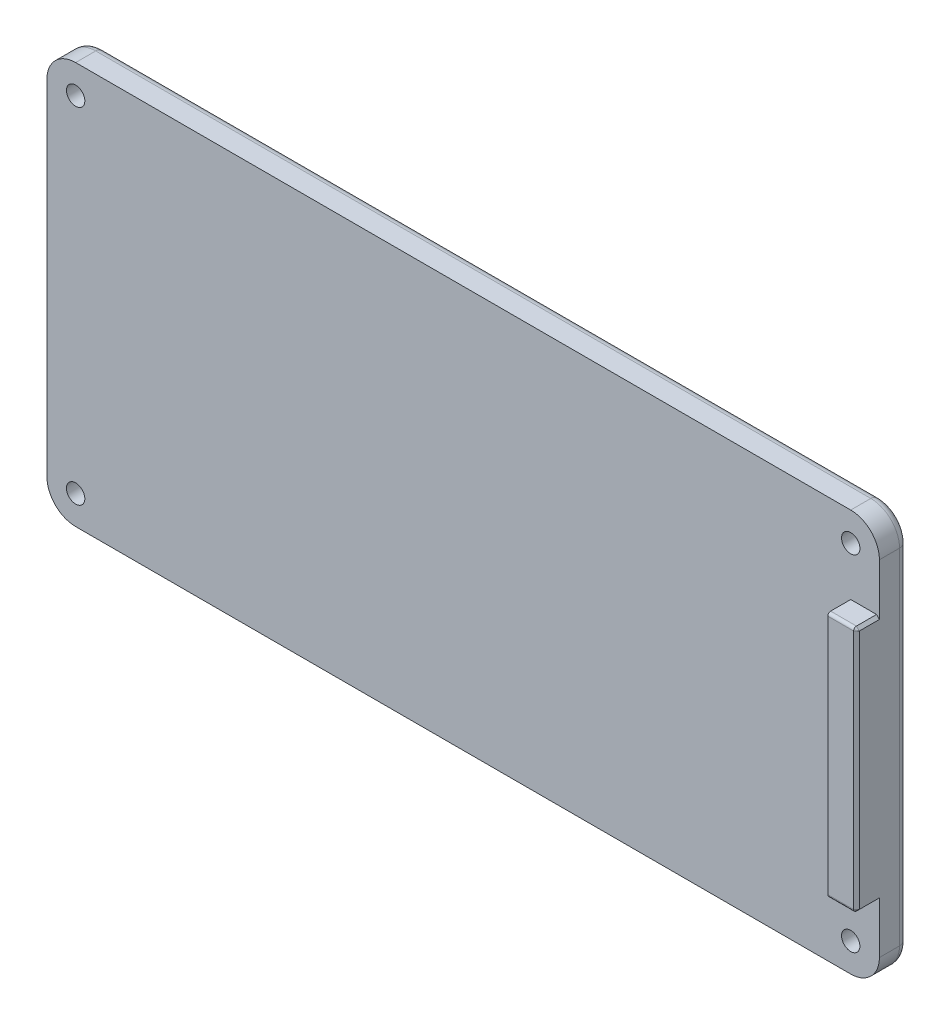
ISO-10303-21;
HEADER;
FILE_DESCRIPTION(('STEP AP214'),'2;1');
FILE_NAME('part.step','',(''),(''),'','','');
FILE_SCHEMA(('AUTOMOTIVE_DESIGN { 1 0 10303 214 1 1 1 1 }'));
ENDSEC;
DATA;
#1=APPLICATION_CONTEXT('core data for automotive mechanical design processes');
#2=APPLICATION_PROTOCOL_DEFINITION('international standard','automotive_design',2000,#1);
#3=PRODUCT_CONTEXT('',#1,'mechanical');
#4=PRODUCT('Part','Part','',(#3));
#5=PRODUCT_RELATED_PRODUCT_CATEGORY('part','',(#4));
#6=PRODUCT_DEFINITION_FORMATION('','',#4);
#7=PRODUCT_DEFINITION_CONTEXT('part definition',#1,'design');
#8=PRODUCT_DEFINITION('design','',#6,#7);
#9=PRODUCT_DEFINITION_SHAPE('','',#8);
#10=(LENGTH_UNIT() NAMED_UNIT(*) SI_UNIT(.MILLI.,.METRE.));
#11=(NAMED_UNIT(*) PLANE_ANGLE_UNIT() SI_UNIT($,.RADIAN.));
#12=(NAMED_UNIT(*) SI_UNIT($,.STERADIAN.) SOLID_ANGLE_UNIT());
#13=UNCERTAINTY_MEASURE_WITH_UNIT(LENGTH_MEASURE(1.E-05),#10,'distance_accuracy_value','');
#14=(GEOMETRIC_REPRESENTATION_CONTEXT(3) GLOBAL_UNCERTAINTY_ASSIGNED_CONTEXT((#13)) GLOBAL_UNIT_ASSIGNED_CONTEXT((#10,
#11,#12)) REPRESENTATION_CONTEXT('',''));
#15=CARTESIAN_POINT('',(0.,0.,0.));
#16=DIRECTION('',(0.,0.,1.));
#17=DIRECTION('',(1.,0.,0.));
#18=AXIS2_PLACEMENT_3D('',#15,#16,#17);
#19=CARTESIAN_POINT('',(0.,0.,5.));
#20=DIRECTION('',(0.,0.,-1.));
#21=DIRECTION('',(-1.,0.,0.));
#22=AXIS2_PLACEMENT_3D('',#19,#20,#21);
#23=PLANE('',#22);
#24=CARTESIAN_POINT('',(-67.5,-30.,5.));
#25=DIRECTION('',(0.,0.,-1.));
#26=DIRECTION('',(-1.,0.,0.));
#27=AXIS2_PLACEMENT_3D('',#24,#25,#26);
#28=CIRCLE('',#27,1.6);
#29=CARTESIAN_POINT('',(-69.1,-30.,5.));
#30=VERTEX_POINT('',#29);
#31=EDGE_CURVE('E255',#30,#30,#28,.T.);
#32=ORIENTED_EDGE('',*,*,#31,.T.);
#33=EDGE_LOOP('',(#32));
#34=FACE_BOUND('',#33,.T.);
#35=CARTESIAN_POINT('',(-67.5,30.,5.));
#36=DIRECTION('',(0.,0.,-1.));
#37=DIRECTION('',(-1.,0.,0.));
#38=AXIS2_PLACEMENT_3D('',#35,#36,#37);
#39=CIRCLE('',#38,1.6);
#40=CARTESIAN_POINT('',(-69.1,30.,5.));
#41=VERTEX_POINT('',#40);
#42=EDGE_CURVE('E243',#41,#41,#39,.T.);
#43=ORIENTED_EDGE('',*,*,#42,.T.);
#44=EDGE_LOOP('',(#43));
#45=FACE_BOUND('',#44,.T.);
#46=CARTESIAN_POINT('',(67.5,-30.,5.));
#47=DIRECTION('',(0.,0.,-1.));
#48=DIRECTION('',(-1.,0.,0.));
#49=AXIS2_PLACEMENT_3D('',#46,#47,#48);
#50=CIRCLE('',#49,1.6);
#51=CARTESIAN_POINT('',(65.9,-30.,5.));
#52=VERTEX_POINT('',#51);
#53=EDGE_CURVE('E231',#52,#52,#50,.T.);
#54=ORIENTED_EDGE('',*,*,#53,.T.);
#55=EDGE_LOOP('',(#54));
#56=FACE_BOUND('',#55,.T.);
#57=CARTESIAN_POINT('',(67.5,30.,5.));
#58=DIRECTION('',(0.,0.,-1.));
#59=DIRECTION('',(-1.,0.,0.));
#60=AXIS2_PLACEMENT_3D('',#57,#58,#59);
#61=CIRCLE('',#60,1.6);
#62=CARTESIAN_POINT('',(65.9,30.,5.));
#63=VERTEX_POINT('',#62);
#64=EDGE_CURVE('E219',#63,#63,#61,.T.);
#65=ORIENTED_EDGE('',*,*,#64,.T.);
#66=EDGE_LOOP('',(#65));
#67=FACE_BOUND('',#66,.T.);
#68=DIRECTION('',(1.,0.,0.));
#69=VECTOR('',#68,1.);
#70=CARTESIAN_POINT('',(72.5,-21.5,5.));
#71=LINE('',#70,#69);
#72=CARTESIAN_POINT('',(67.5,-21.5,5.));
#73=VERTEX_POINT('',#72);
#74=CARTESIAN_POINT('',(72.,-21.5,5.));
#75=VERTEX_POINT('',#74);
#76=EDGE_CURVE('E204',#73,#75,#71,.T.);
#77=ORIENTED_EDGE('',*,*,#76,.F.);
#78=DIRECTION('',(0.,-1.,0.));
#79=VECTOR('',#78,1.);
#80=CARTESIAN_POINT('',(67.5,21.5,5.));
#81=LINE('',#80,#79);
#82=CARTESIAN_POINT('',(67.5,21.5,5.));
#83=VERTEX_POINT('',#82);
#84=EDGE_CURVE('E189',#83,#73,#81,.T.);
#85=ORIENTED_EDGE('',*,*,#84,.F.);
#86=DIRECTION('',(-1.,0.,0.));
#87=VECTOR('',#86,1.);
#88=CARTESIAN_POINT('',(72.5,21.5,5.));
#89=LINE('',#88,#87);
#90=CARTESIAN_POINT('',(72.,21.5,5.));
#91=VERTEX_POINT('',#90);
#92=EDGE_CURVE('E177',#91,#83,#89,.T.);
#93=ORIENTED_EDGE('',*,*,#92,.F.);
#94=DIRECTION('',(-0.707106781186557,0.707106781186538,0.));
#95=VECTOR('',#94,1.);
#96=CARTESIAN_POINT('',(46.749999999999,46.7500000000003,5.));
#97=LINE('',#96,#95);
#98=CARTESIAN_POINT('',(72.5,21.,5.));
#99=VERTEX_POINT('',#98);
#100=EDGE_CURVE('E326',#91,#99,#97,.F.);
#101=ORIENTED_EDGE('',*,*,#100,.T.);
#102=DIRECTION('',(0.,1.,0.));
#103=VECTOR('',#102,1.);
#104=CARTESIAN_POINT('',(72.5,-35.,5.));
#105=LINE('',#104,#103);
#106=CARTESIAN_POINT('',(72.5,30.,5.));
#107=VERTEX_POINT('',#106);
#108=EDGE_CURVE('E258',#99,#107,#105,.T.);
#109=ORIENTED_EDGE('',*,*,#108,.T.);
#110=CARTESIAN_POINT('',(67.5,30.,5.));
#111=DIRECTION('',(0.,0.,-1.));
#112=DIRECTION('',(-1.,0.,0.));
#113=AXIS2_PLACEMENT_3D('',#110,#111,#112);
#114=CIRCLE('',#113,5.);
#115=CARTESIAN_POINT('',(67.5,35.,5.));
#116=VERTEX_POINT('',#115);
#117=EDGE_CURVE('E281',#107,#116,#114,.F.);
#118=ORIENTED_EDGE('',*,*,#117,.T.);
#119=DIRECTION('',(-1.,0.,0.));
#120=VECTOR('',#119,1.);
#121=CARTESIAN_POINT('',(-72.5,35.,5.));
#122=LINE('',#121,#120);
#123=CARTESIAN_POINT('',(-67.5,35.,5.));
#124=VERTEX_POINT('',#123);
#125=EDGE_CURVE('E261',#116,#124,#122,.T.);
#126=ORIENTED_EDGE('',*,*,#125,.T.);
#127=CARTESIAN_POINT('',(-67.5,30.,5.));
#128=DIRECTION('',(0.,0.,-1.));
#129=DIRECTION('',(-1.,0.,0.));
#130=AXIS2_PLACEMENT_3D('',#127,#128,#129);
#131=CIRCLE('',#130,5.);
#132=CARTESIAN_POINT('',(-72.5,30.,5.));
#133=VERTEX_POINT('',#132);
#134=EDGE_CURVE('E279',#124,#133,#131,.F.);
#135=ORIENTED_EDGE('',*,*,#134,.T.);
#136=DIRECTION('',(0.,-1.,0.));
#137=VECTOR('',#136,1.);
#138=CARTESIAN_POINT('',(-72.5,-35.,5.));
#139=LINE('',#138,#137);
#140=CARTESIAN_POINT('',(-72.5,-30.,5.));
#141=VERTEX_POINT('',#140);
#142=EDGE_CURVE('E264',#133,#141,#139,.T.);
#143=ORIENTED_EDGE('',*,*,#142,.T.);
#144=CARTESIAN_POINT('',(-67.5,-30.,5.));
#145=DIRECTION('',(0.,0.,-1.));
#146=DIRECTION('',(-1.,0.,0.));
#147=AXIS2_PLACEMENT_3D('',#144,#145,#146);
#148=CIRCLE('',#147,5.);
#149=CARTESIAN_POINT('',(-67.5,-35.,5.));
#150=VERTEX_POINT('',#149);
#151=EDGE_CURVE('E283',#141,#150,#148,.F.);
#152=ORIENTED_EDGE('',*,*,#151,.T.);
#153=DIRECTION('',(1.,0.,0.));
#154=VECTOR('',#153,1.);
#155=CARTESIAN_POINT('',(-72.5,-35.,5.));
#156=LINE('',#155,#154);
#157=CARTESIAN_POINT('',(67.5,-35.,5.));
#158=VERTEX_POINT('',#157);
#159=EDGE_CURVE('E267',#150,#158,#156,.T.);
#160=ORIENTED_EDGE('',*,*,#159,.T.);
#161=CARTESIAN_POINT('',(67.5,-30.,5.));
#162=DIRECTION('',(0.,0.,-1.));
#163=DIRECTION('',(-1.,0.,0.));
#164=AXIS2_PLACEMENT_3D('',#161,#162,#163);
#165=CIRCLE('',#164,5.);
#166=CARTESIAN_POINT('',(72.5,-30.,5.));
#167=VERTEX_POINT('',#166);
#168=EDGE_CURVE('E285',#158,#167,#165,.F.);
#169=ORIENTED_EDGE('',*,*,#168,.T.);
#170=CARTESIAN_POINT('',(72.5,-21.,5.));
#171=VERTEX_POINT('',#170);
#172=EDGE_CURVE('E259',#167,#171,#105,.T.);
#173=ORIENTED_EDGE('',*,*,#172,.T.);
#174=DIRECTION('',(0.707106781186538,0.707106781186557,0.));
#175=VECTOR('',#174,1.);
#176=CARTESIAN_POINT('',(46.750000000001,-46.7499999999997,5.));
#177=LINE('',#176,#175);
#178=EDGE_CURVE('E324',#171,#75,#177,.F.);
#179=ORIENTED_EDGE('',*,*,#178,.T.);
#180=EDGE_LOOP('',(#77,#85,#93,#101,#109,#118,#126,#135,#143,#152,#160,#169,#173,#179));
#181=FACE_BOUND('',#180,.T.);
#182=ADVANCED_FACE('F39',(#34,#45,#56,#67,#181),#23,.F.);
#183=CARTESIAN_POINT('',(72.5,-35.,5.));
#184=DIRECTION('',(-1.,0.,0.));
#185=DIRECTION('',(0.,0.,1.));
#186=AXIS2_PLACEMENT_3D('',#183,#184,#185);
#187=PLANE('',#186);
#188=DIRECTION('',(0.,0.,-1.));
#189=VECTOR('',#188,1.);
#190=CARTESIAN_POINT('',(72.5,-30.,5.));
#191=LINE('',#190,#189);
#192=CARTESIAN_POINT('',(72.5,-30.,1.5));
#193=VERTEX_POINT('',#192);
#194=EDGE_CURVE('E272',#167,#193,#191,.T.);
#195=ORIENTED_EDGE('',*,*,#194,.T.);
#196=DIRECTION('',(0.,1.,0.));
#197=VECTOR('',#196,1.);
#198=CARTESIAN_POINT('',(72.5,30.,1.5));
#199=LINE('',#198,#197);
#200=CARTESIAN_POINT('',(72.5,30.,1.5));
#201=VERTEX_POINT('',#200);
#202=EDGE_CURVE('E11',#193,#201,#199,.T.);
#203=ORIENTED_EDGE('',*,*,#202,.T.);
#204=DIRECTION('',(0.,0.,-1.));
#205=VECTOR('',#204,1.);
#206=CARTESIAN_POINT('',(72.5,30.,5.));
#207=LINE('',#206,#205);
#208=EDGE_CURVE('E270',#201,#107,#207,.F.);
#209=ORIENTED_EDGE('',*,*,#208,.T.);
#210=ORIENTED_EDGE('',*,*,#108,.F.);
#211=DIRECTION('',(0.,0.,1.));
#212=VECTOR('',#211,1.);
#213=CARTESIAN_POINT('',(72.5,21.,5.));
#214=LINE('',#213,#212);
#215=CARTESIAN_POINT('',(72.5,21.,8.49999999999999));
#216=VERTEX_POINT('',#215);
#217=EDGE_CURVE('E310',#99,#216,#214,.T.);
#218=ORIENTED_EDGE('',*,*,#217,.T.);
#219=DIRECTION('',(0.,-1.,0.));
#220=VECTOR('',#219,1.);
#221=CARTESIAN_POINT('',(72.5,-35.,8.49999999999999));
#222=LINE('',#221,#220);
#223=CARTESIAN_POINT('',(72.5,-21.,8.49999999999999));
#224=VERTEX_POINT('',#223);
#225=EDGE_CURVE('E308',#216,#224,#222,.T.);
#226=ORIENTED_EDGE('',*,*,#225,.T.);
#227=DIRECTION('',(0.,0.,-1.));
#228=VECTOR('',#227,1.);
#229=CARTESIAN_POINT('',(72.5,-21.,5.));
#230=LINE('',#229,#228);
#231=EDGE_CURVE('E312',#224,#171,#230,.T.);
#232=ORIENTED_EDGE('',*,*,#231,.T.);
#233=ORIENTED_EDGE('',*,*,#172,.F.);
#234=EDGE_LOOP('',(#195,#203,#209,#210,#218,#226,#232,#233));
#235=FACE_BOUND('',#234,.T.);
#236=ADVANCED_FACE('F439',(#235),#187,.F.);
#237=CARTESIAN_POINT('',(-72.5,35.,5.));
#238=DIRECTION('',(0.,-1.,0.));
#239=DIRECTION('',(1.,0.,0.));
#240=AXIS2_PLACEMENT_3D('',#237,#238,#239);
#241=PLANE('',#240);
#242=DIRECTION('',(0.,0.,-1.));
#243=VECTOR('',#242,1.);
#244=CARTESIAN_POINT('',(67.5,35.,5.));
#245=LINE('',#244,#243);
#246=CARTESIAN_POINT('',(67.5,35.,1.5));
#247=VERTEX_POINT('',#246);
#248=EDGE_CURVE('E294',#116,#247,#245,.T.);
#249=ORIENTED_EDGE('',*,*,#248,.T.);
#250=DIRECTION('',(-1.,0.,0.));
#251=VECTOR('',#250,1.);
#252=CARTESIAN_POINT('',(-67.5,35.,1.5));
#253=LINE('',#252,#251);
#254=CARTESIAN_POINT('',(-67.5,35.,1.5));
#255=VERTEX_POINT('',#254);
#256=EDGE_CURVE('E367',#247,#255,#253,.T.);
#257=ORIENTED_EDGE('',*,*,#256,.T.);
#258=DIRECTION('',(0.,0.,-1.));
#259=VECTOR('',#258,1.);
#260=CARTESIAN_POINT('',(-67.5,35.,5.));
#261=LINE('',#260,#259);
#262=EDGE_CURVE('E292',#255,#124,#261,.F.);
#263=ORIENTED_EDGE('',*,*,#262,.T.);
#264=ORIENTED_EDGE('',*,*,#125,.F.);
#265=EDGE_LOOP('',(#249,#257,#263,#264));
#266=FACE_BOUND('',#265,.T.);
#267=ADVANCED_FACE('F480',(#266),#241,.F.);
#268=CARTESIAN_POINT('',(-72.5,-35.,5.));
#269=DIRECTION('',(1.,0.,0.));
#270=DIRECTION('',(0.,0.,-1.));
#271=AXIS2_PLACEMENT_3D('',#268,#269,#270);
#272=PLANE('',#271);
#273=DIRECTION('',(0.,0.,-1.));
#274=VECTOR('',#273,1.);
#275=CARTESIAN_POINT('',(-72.5,30.,5.));
#276=LINE('',#275,#274);
#277=CARTESIAN_POINT('',(-72.5,30.,1.5));
#278=VERTEX_POINT('',#277);
#279=EDGE_CURVE('E287',#133,#278,#276,.T.);
#280=ORIENTED_EDGE('',*,*,#279,.T.);
#281=DIRECTION('',(0.,-1.,0.));
#282=VECTOR('',#281,1.);
#283=CARTESIAN_POINT('',(-72.5,-30.,1.5));
#284=LINE('',#283,#282);
#285=CARTESIAN_POINT('',(-72.5,-30.,1.5));
#286=VERTEX_POINT('',#285);
#287=EDGE_CURVE('E363',#278,#286,#284,.T.);
#288=ORIENTED_EDGE('',*,*,#287,.T.);
#289=DIRECTION('',(0.,0.,-1.));
#290=VECTOR('',#289,1.);
#291=CARTESIAN_POINT('',(-72.5,-30.,5.));
#292=LINE('',#291,#290);
#293=EDGE_CURVE('E290',#286,#141,#292,.F.);
#294=ORIENTED_EDGE('',*,*,#293,.T.);
#295=ORIENTED_EDGE('',*,*,#142,.F.);
#296=EDGE_LOOP('',(#280,#288,#294,#295));
#297=FACE_BOUND('',#296,.T.);
#298=ADVANCED_FACE('F408',(#297),#272,.F.);
#299=CARTESIAN_POINT('',(-72.5,-35.,5.));
#300=DIRECTION('',(0.,1.,0.));
#301=DIRECTION('',(-1.,0.,0.));
#302=AXIS2_PLACEMENT_3D('',#299,#300,#301);
#303=PLANE('',#302);
#304=DIRECTION('',(0.,0.,-1.));
#305=VECTOR('',#304,1.);
#306=CARTESIAN_POINT('',(-67.5,-35.,5.));
#307=LINE('',#306,#305);
#308=CARTESIAN_POINT('',(-67.5,-35.,1.5));
#309=VERTEX_POINT('',#308);
#310=EDGE_CURVE('E274',#150,#309,#307,.T.);
#311=ORIENTED_EDGE('',*,*,#310,.T.);
#312=DIRECTION('',(1.,0.,0.));
#313=VECTOR('',#312,1.);
#314=CARTESIAN_POINT('',(67.5,-35.,1.5));
#315=LINE('',#314,#313);
#316=CARTESIAN_POINT('',(67.5,-35.,1.5));
#317=VERTEX_POINT('',#316);
#318=EDGE_CURVE('E359',#309,#317,#315,.T.);
#319=ORIENTED_EDGE('',*,*,#318,.T.);
#320=DIRECTION('',(0.,0.,-1.));
#321=VECTOR('',#320,1.);
#322=CARTESIAN_POINT('',(67.5,-35.,5.));
#323=LINE('',#322,#321);
#324=EDGE_CURVE('E277',#317,#158,#323,.F.);
#325=ORIENTED_EDGE('',*,*,#324,.T.);
#326=ORIENTED_EDGE('',*,*,#159,.F.);
#327=EDGE_LOOP('',(#311,#319,#325,#326));
#328=FACE_BOUND('',#327,.T.);
#329=ADVANCED_FACE('F419',(#328),#303,.F.);
#330=CARTESIAN_POINT('',(0.,0.,0.));
#331=DIRECTION('',(0.,0.,-1.));
#332=DIRECTION('',(-1.,0.,0.));
#333=AXIS2_PLACEMENT_3D('',#330,#331,#332);
#334=PLANE('',#333);
#335=DIRECTION('',(0.,1.,0.));
#336=VECTOR('',#335,1.);
#337=CARTESIAN_POINT('',(71.,-30.,0.));
#338=LINE('',#337,#336);
#339=CARTESIAN_POINT('',(71.,30.,0.));
#340=VERTEX_POINT('',#339);
#341=CARTESIAN_POINT('',(71.,-30.,0.));
#342=VERTEX_POINT('',#341);
#343=EDGE_CURVE('E328',#340,#342,#338,.F.);
#344=ORIENTED_EDGE('',*,*,#343,.T.);
#345=CARTESIAN_POINT('',(67.5,-30.,0.));
#346=DIRECTION('',(0.,0.,-1.));
#347=DIRECTION('',(-1.,0.,0.));
#348=AXIS2_PLACEMENT_3D('',#345,#346,#347);
#349=CIRCLE('',#348,3.5);
#350=CARTESIAN_POINT('',(67.5,-33.5,0.));
#351=VERTEX_POINT('',#350);
#352=EDGE_CURVE('E353',#342,#351,#349,.T.);
#353=ORIENTED_EDGE('',*,*,#352,.T.);
#354=DIRECTION('',(1.,0.,0.));
#355=VECTOR('',#354,1.);
#356=CARTESIAN_POINT('',(-67.5,-33.5,0.));
#357=LINE('',#356,#355);
#358=CARTESIAN_POINT('',(-67.5,-33.5,0.));
#359=VERTEX_POINT('',#358);
#360=EDGE_CURVE('E351',#351,#359,#357,.F.);
#361=ORIENTED_EDGE('',*,*,#360,.T.);
#362=CARTESIAN_POINT('',(-67.5,-30.,0.));
#363=DIRECTION('',(0.,0.,-1.));
#364=DIRECTION('',(-1.,0.,0.));
#365=AXIS2_PLACEMENT_3D('',#362,#363,#364);
#366=CIRCLE('',#365,3.5);
#367=CARTESIAN_POINT('',(-71.,-30.,0.));
#368=VERTEX_POINT('',#367);
#369=EDGE_CURVE('E349',#359,#368,#366,.T.);
#370=ORIENTED_EDGE('',*,*,#369,.T.);
#371=DIRECTION('',(0.,-1.,0.));
#372=VECTOR('',#371,1.);
#373=CARTESIAN_POINT('',(-71.,30.,0.));
#374=LINE('',#373,#372);
#375=CARTESIAN_POINT('',(-71.,30.,0.));
#376=VERTEX_POINT('',#375);
#377=EDGE_CURVE('E347',#368,#376,#374,.F.);
#378=ORIENTED_EDGE('',*,*,#377,.T.);
#379=CARTESIAN_POINT('',(-67.5,30.,0.));
#380=DIRECTION('',(0.,0.,-1.));
#381=DIRECTION('',(-1.,0.,0.));
#382=AXIS2_PLACEMENT_3D('',#379,#380,#381);
#383=CIRCLE('',#382,3.5);
#384=CARTESIAN_POINT('',(-67.5,33.5,0.));
#385=VERTEX_POINT('',#384);
#386=EDGE_CURVE('E345',#376,#385,#383,.T.);
#387=ORIENTED_EDGE('',*,*,#386,.T.);
#388=DIRECTION('',(-1.,0.,0.));
#389=VECTOR('',#388,1.);
#390=CARTESIAN_POINT('',(67.5,33.5,0.));
#391=LINE('',#390,#389);
#392=CARTESIAN_POINT('',(67.5,33.5,0.));
#393=VERTEX_POINT('',#392);
#394=EDGE_CURVE('E343',#385,#393,#391,.F.);
#395=ORIENTED_EDGE('',*,*,#394,.T.);
#396=CARTESIAN_POINT('',(67.5,30.,0.));
#397=DIRECTION('',(0.,0.,-1.));
#398=DIRECTION('',(-1.,0.,0.));
#399=AXIS2_PLACEMENT_3D('',#396,#397,#398);
#400=CIRCLE('',#399,3.5);
#401=EDGE_CURVE('E341',#393,#340,#400,.T.);
#402=ORIENTED_EDGE('',*,*,#401,.T.);
#403=EDGE_LOOP('',(#344,#353,#361,#370,#378,#387,#395,#402));
#404=FACE_BOUND('',#403,.T.);
#405=CARTESIAN_POINT('',(67.5,30.,0.));
#406=DIRECTION('',(0.,0.,-1.));
#407=DIRECTION('',(-1.,0.,0.));
#408=AXIS2_PLACEMENT_3D('',#405,#406,#407);
#409=CIRCLE('',#408,3.15);
#410=CARTESIAN_POINT('',(64.35,30.,0.));
#411=VERTEX_POINT('',#410);
#412=EDGE_CURVE('E199',#411,#411,#409,.T.);
#413=ORIENTED_EDGE('',*,*,#412,.F.);
#414=EDGE_LOOP('',(#413));
#415=FACE_BOUND('',#414,.T.);
#416=CARTESIAN_POINT('',(67.5,-30.,0.));
#417=DIRECTION('',(0.,0.,-1.));
#418=DIRECTION('',(-1.,0.,0.));
#419=AXIS2_PLACEMENT_3D('',#416,#417,#418);
#420=CIRCLE('',#419,3.15);
#421=CARTESIAN_POINT('',(64.35,-30.,0.));
#422=VERTEX_POINT('',#421);
#423=EDGE_CURVE('E222',#422,#422,#420,.T.);
#424=ORIENTED_EDGE('',*,*,#423,.F.);
#425=EDGE_LOOP('',(#424));
#426=FACE_BOUND('',#425,.T.);
#427=CARTESIAN_POINT('',(-67.5,30.,0.));
#428=DIRECTION('',(0.,0.,-1.));
#429=DIRECTION('',(-1.,0.,0.));
#430=AXIS2_PLACEMENT_3D('',#427,#428,#429);
#431=CIRCLE('',#430,3.15);
#432=CARTESIAN_POINT('',(-70.65,30.,0.));
#433=VERTEX_POINT('',#432);
#434=EDGE_CURVE('E234',#433,#433,#431,.T.);
#435=ORIENTED_EDGE('',*,*,#434,.F.);
#436=EDGE_LOOP('',(#435));
#437=FACE_BOUND('',#436,.T.);
#438=CARTESIAN_POINT('',(-67.5,-30.,0.));
#439=DIRECTION('',(0.,0.,-1.));
#440=DIRECTION('',(-1.,0.,0.));
#441=AXIS2_PLACEMENT_3D('',#438,#439,#440);
#442=CIRCLE('',#441,3.15);
#443=CARTESIAN_POINT('',(-70.65,-30.,0.));
#444=VERTEX_POINT('',#443);
#445=EDGE_CURVE('E246',#444,#444,#442,.T.);
#446=ORIENTED_EDGE('',*,*,#445,.F.);
#447=EDGE_LOOP('',(#446));
#448=FACE_BOUND('',#447,.T.);
#449=ADVANCED_FACE('F499',(#404,#415,#426,#437,#448),#334,.T.);
#450=CARTESIAN_POINT('',(67.5,-30.,5.));
#451=DIRECTION('',(0.,0.,-1.));
#452=DIRECTION('',(-1.,0.,0.));
#453=AXIS2_PLACEMENT_3D('',#450,#451,#452);
#454=CYLINDRICAL_SURFACE('',#453,5.);
#455=ORIENTED_EDGE('',*,*,#324,.F.);
#456=CARTESIAN_POINT('',(67.5,-30.,1.5));
#457=DIRECTION('',(0.,0.,-1.));
#458=DIRECTION('',(-1.,0.,0.));
#459=AXIS2_PLACEMENT_3D('',#456,#457,#458);
#460=CIRCLE('',#459,5.);
#461=EDGE_CURVE('E356',#317,#193,#460,.F.);
#462=ORIENTED_EDGE('',*,*,#461,.T.);
#463=ORIENTED_EDGE('',*,*,#194,.F.);
#464=ORIENTED_EDGE('',*,*,#168,.F.);
#465=EDGE_LOOP('',(#455,#462,#463,#464));
#466=FACE_BOUND('',#465,.T.);
#467=ADVANCED_FACE('F436',(#466),#454,.T.);
#468=CARTESIAN_POINT('',(-67.5,-30.,5.));
#469=DIRECTION('',(0.,0.,-1.));
#470=DIRECTION('',(-1.,0.,0.));
#471=AXIS2_PLACEMENT_3D('',#468,#469,#470);
#472=CYLINDRICAL_SURFACE('',#471,5.);
#473=ORIENTED_EDGE('',*,*,#293,.F.);
#474=CARTESIAN_POINT('',(-67.5,-30.,1.5));
#475=DIRECTION('',(0.,0.,-1.));
#476=DIRECTION('',(-1.,0.,0.));
#477=AXIS2_PLACEMENT_3D('',#474,#475,#476);
#478=CIRCLE('',#477,5.);
#479=EDGE_CURVE('E361',#286,#309,#478,.F.);
#480=ORIENTED_EDGE('',*,*,#479,.T.);
#481=ORIENTED_EDGE('',*,*,#310,.F.);
#482=ORIENTED_EDGE('',*,*,#151,.F.);
#483=EDGE_LOOP('',(#473,#480,#481,#482));
#484=FACE_BOUND('',#483,.T.);
#485=ADVANCED_FACE('F414',(#484),#472,.T.);
#486=CARTESIAN_POINT('',(67.5,30.,5.));
#487=DIRECTION('',(0.,0.,-1.));
#488=DIRECTION('',(-1.,0.,0.));
#489=AXIS2_PLACEMENT_3D('',#486,#487,#488);
#490=CYLINDRICAL_SURFACE('',#489,5.);
#491=ORIENTED_EDGE('',*,*,#208,.F.);
#492=CARTESIAN_POINT('',(67.5,30.,1.5));
#493=DIRECTION('',(0.,0.,-1.));
#494=DIRECTION('',(-1.,0.,0.));
#495=AXIS2_PLACEMENT_3D('',#492,#493,#494);
#496=CIRCLE('',#495,5.);
#497=EDGE_CURVE('E48',#201,#247,#496,.F.);
#498=ORIENTED_EDGE('',*,*,#497,.T.);
#499=ORIENTED_EDGE('',*,*,#248,.F.);
#500=ORIENTED_EDGE('',*,*,#117,.F.);
#501=EDGE_LOOP('',(#491,#498,#499,#500));
#502=FACE_BOUND('',#501,.T.);
#503=ADVANCED_FACE('F478',(#502),#490,.T.);
#504=CARTESIAN_POINT('',(-67.5,30.,5.));
#505=DIRECTION('',(0.,0.,-1.));
#506=DIRECTION('',(-1.,0.,0.));
#507=AXIS2_PLACEMENT_3D('',#504,#505,#506);
#508=CYLINDRICAL_SURFACE('',#507,5.);
#509=ORIENTED_EDGE('',*,*,#262,.F.);
#510=CARTESIAN_POINT('',(-67.5,30.,1.5));
#511=DIRECTION('',(0.,0.,-1.));
#512=DIRECTION('',(-1.,0.,0.));
#513=AXIS2_PLACEMENT_3D('',#510,#511,#512);
#514=CIRCLE('',#513,5.);
#515=EDGE_CURVE('E365',#255,#278,#514,.F.);
#516=ORIENTED_EDGE('',*,*,#515,.T.);
#517=ORIENTED_EDGE('',*,*,#279,.F.);
#518=ORIENTED_EDGE('',*,*,#134,.F.);
#519=EDGE_LOOP('',(#509,#516,#517,#518));
#520=FACE_BOUND('',#519,.T.);
#521=ADVANCED_FACE('F404',(#520),#508,.T.);
#522=CARTESIAN_POINT('',(-67.5,-30.,0.));
#523=DIRECTION('',(0.,0.,-1.));
#524=DIRECTION('',(-1.,0.,0.));
#525=AXIS2_PLACEMENT_3D('',#522,#523,#524);
#526=CYLINDRICAL_SURFACE('',#525,1.6);
#527=ORIENTED_EDGE('',*,*,#31,.F.);
#528=EDGE_LOOP('',(#527));
#529=FACE_BOUND('',#528,.T.);
#530=CARTESIAN_POINT('',(-67.5,-30.,2.55));
#531=DIRECTION('',(0.,0.,-1.));
#532=DIRECTION('',(-1.,0.,0.));
#533=AXIS2_PLACEMENT_3D('',#530,#531,#532);
#534=CIRCLE('',#533,1.6);
#535=CARTESIAN_POINT('',(-69.1,-30.,2.55));
#536=VERTEX_POINT('',#535);
#537=EDGE_CURVE('E252',#536,#536,#534,.T.);
#538=ORIENTED_EDGE('',*,*,#537,.T.);
#539=EDGE_LOOP('',(#538));
#540=FACE_BOUND('',#539,.T.);
#541=ADVANCED_FACE('F497',(#529,#540),#526,.F.);
#542=CARTESIAN_POINT('',(-67.5,-30.,0.999999999999997));
#543=DIRECTION('',(0.,0.,-1.));
#544=DIRECTION('',(-1.,0.,0.));
#545=AXIS2_PLACEMENT_3D('',#542,#543,#544);
#546=CONICAL_SURFACE('',#545,3.15,0.785398163397447);
#547=ORIENTED_EDGE('',*,*,#537,.F.);
#548=EDGE_LOOP('',(#547));
#549=FACE_BOUND('',#548,.T.);
#550=CARTESIAN_POINT('',(-67.5,-30.,0.999999999999997));
#551=DIRECTION('',(0.,0.,-1.));
#552=DIRECTION('',(-1.,0.,0.));
#553=AXIS2_PLACEMENT_3D('',#550,#551,#552);
#554=CIRCLE('',#553,3.15);
#555=CARTESIAN_POINT('',(-70.65,-30.,0.999999999999997));
#556=VERTEX_POINT('',#555);
#557=EDGE_CURVE('E249',#556,#556,#554,.T.);
#558=ORIENTED_EDGE('',*,*,#557,.T.);
#559=EDGE_LOOP('',(#558));
#560=FACE_BOUND('',#559,.T.);
#561=ADVANCED_FACE('F695',(#549,#560),#546,.F.);
#562=CARTESIAN_POINT('',(-67.5,-30.,0.));
#563=DIRECTION('',(0.,0.,-1.));
#564=DIRECTION('',(-1.,0.,0.));
#565=AXIS2_PLACEMENT_3D('',#562,#563,#564);
#566=CYLINDRICAL_SURFACE('',#565,3.15);
#567=ORIENTED_EDGE('',*,*,#557,.F.);
#568=EDGE_LOOP('',(#567));
#569=FACE_BOUND('',#568,.T.);
#570=ORIENTED_EDGE('',*,*,#445,.T.);
#571=EDGE_LOOP('',(#570));
#572=FACE_BOUND('',#571,.T.);
#573=ADVANCED_FACE('F692',(#569,#572),#566,.F.);
#574=CARTESIAN_POINT('',(-67.5,30.,0.));
#575=DIRECTION('',(0.,0.,-1.));
#576=DIRECTION('',(-1.,0.,0.));
#577=AXIS2_PLACEMENT_3D('',#574,#575,#576);
#578=CYLINDRICAL_SURFACE('',#577,1.6);
#579=ORIENTED_EDGE('',*,*,#42,.F.);
#580=EDGE_LOOP('',(#579));
#581=FACE_BOUND('',#580,.T.);
#582=CARTESIAN_POINT('',(-67.5,30.,2.55));
#583=DIRECTION('',(0.,0.,-1.));
#584=DIRECTION('',(-1.,0.,0.));
#585=AXIS2_PLACEMENT_3D('',#582,#583,#584);
#586=CIRCLE('',#585,1.6);
#587=CARTESIAN_POINT('',(-69.1,30.,2.55));
#588=VERTEX_POINT('',#587);
#589=EDGE_CURVE('E240',#588,#588,#586,.T.);
#590=ORIENTED_EDGE('',*,*,#589,.T.);
#591=EDGE_LOOP('',(#590));
#592=FACE_BOUND('',#591,.T.);
#593=ADVANCED_FACE('F688',(#581,#592),#578,.F.);
#594=CARTESIAN_POINT('',(-67.5,30.,0.999999999999997));
#595=DIRECTION('',(0.,0.,-1.));
#596=DIRECTION('',(-1.,0.,0.));
#597=AXIS2_PLACEMENT_3D('',#594,#595,#596);
#598=CONICAL_SURFACE('',#597,3.15,0.785398163397447);
#599=ORIENTED_EDGE('',*,*,#589,.F.);
#600=EDGE_LOOP('',(#599));
#601=FACE_BOUND('',#600,.T.);
#602=CARTESIAN_POINT('',(-67.5,30.,0.999999999999997));
#603=DIRECTION('',(0.,0.,-1.));
#604=DIRECTION('',(-1.,0.,0.));
#605=AXIS2_PLACEMENT_3D('',#602,#603,#604);
#606=CIRCLE('',#605,3.15);
#607=CARTESIAN_POINT('',(-70.65,30.,0.999999999999997));
#608=VERTEX_POINT('',#607);
#609=EDGE_CURVE('E237',#608,#608,#606,.T.);
#610=ORIENTED_EDGE('',*,*,#609,.T.);
#611=EDGE_LOOP('',(#610));
#612=FACE_BOUND('',#611,.T.);
#613=ADVANCED_FACE('F684',(#601,#612),#598,.F.);
#614=CARTESIAN_POINT('',(-67.5,30.,0.));
#615=DIRECTION('',(0.,0.,-1.));
#616=DIRECTION('',(-1.,0.,0.));
#617=AXIS2_PLACEMENT_3D('',#614,#615,#616);
#618=CYLINDRICAL_SURFACE('',#617,3.15);
#619=ORIENTED_EDGE('',*,*,#609,.F.);
#620=EDGE_LOOP('',(#619));
#621=FACE_BOUND('',#620,.T.);
#622=ORIENTED_EDGE('',*,*,#434,.T.);
#623=EDGE_LOOP('',(#622));
#624=FACE_BOUND('',#623,.T.);
#625=ADVANCED_FACE('F680',(#621,#624),#618,.F.);
#626=CARTESIAN_POINT('',(67.5,-30.,0.));
#627=DIRECTION('',(0.,0.,-1.));
#628=DIRECTION('',(-1.,0.,0.));
#629=AXIS2_PLACEMENT_3D('',#626,#627,#628);
#630=CYLINDRICAL_SURFACE('',#629,1.6);
#631=ORIENTED_EDGE('',*,*,#53,.F.);
#632=EDGE_LOOP('',(#631));
#633=FACE_BOUND('',#632,.T.);
#634=CARTESIAN_POINT('',(67.5,-30.,2.55));
#635=DIRECTION('',(0.,0.,-1.));
#636=DIRECTION('',(-1.,0.,0.));
#637=AXIS2_PLACEMENT_3D('',#634,#635,#636);
#638=CIRCLE('',#637,1.6);
#639=CARTESIAN_POINT('',(65.9,-30.,2.55));
#640=VERTEX_POINT('',#639);
#641=EDGE_CURVE('E228',#640,#640,#638,.T.);
#642=ORIENTED_EDGE('',*,*,#641,.T.);
#643=EDGE_LOOP('',(#642));
#644=FACE_BOUND('',#643,.T.);
#645=ADVANCED_FACE('F676',(#633,#644),#630,.F.);
#646=CARTESIAN_POINT('',(67.5,-30.,0.999999999999997));
#647=DIRECTION('',(0.,0.,-1.));
#648=DIRECTION('',(-1.,0.,0.));
#649=AXIS2_PLACEMENT_3D('',#646,#647,#648);
#650=CONICAL_SURFACE('',#649,3.15,0.785398163397447);
#651=ORIENTED_EDGE('',*,*,#641,.F.);
#652=EDGE_LOOP('',(#651));
#653=FACE_BOUND('',#652,.T.);
#654=CARTESIAN_POINT('',(67.5,-30.,0.999999999999997));
#655=DIRECTION('',(0.,0.,-1.));
#656=DIRECTION('',(-1.,0.,0.));
#657=AXIS2_PLACEMENT_3D('',#654,#655,#656);
#658=CIRCLE('',#657,3.15);
#659=CARTESIAN_POINT('',(64.35,-30.,0.999999999999997));
#660=VERTEX_POINT('',#659);
#661=EDGE_CURVE('E225',#660,#660,#658,.T.);
#662=ORIENTED_EDGE('',*,*,#661,.T.);
#663=EDGE_LOOP('',(#662));
#664=FACE_BOUND('',#663,.T.);
#665=ADVANCED_FACE('F672',(#653,#664),#650,.F.);
#666=CARTESIAN_POINT('',(67.5,-30.,0.));
#667=DIRECTION('',(0.,0.,-1.));
#668=DIRECTION('',(-1.,0.,0.));
#669=AXIS2_PLACEMENT_3D('',#666,#667,#668);
#670=CYLINDRICAL_SURFACE('',#669,3.15);
#671=ORIENTED_EDGE('',*,*,#661,.F.);
#672=EDGE_LOOP('',(#671));
#673=FACE_BOUND('',#672,.T.);
#674=ORIENTED_EDGE('',*,*,#423,.T.);
#675=EDGE_LOOP('',(#674));
#676=FACE_BOUND('',#675,.T.);
#677=ADVANCED_FACE('F668',(#673,#676),#670,.F.);
#678=CARTESIAN_POINT('',(67.5,30.,0.));
#679=DIRECTION('',(0.,0.,-1.));
#680=DIRECTION('',(-1.,0.,0.));
#681=AXIS2_PLACEMENT_3D('',#678,#679,#680);
#682=CYLINDRICAL_SURFACE('',#681,1.6);
#683=ORIENTED_EDGE('',*,*,#64,.F.);
#684=EDGE_LOOP('',(#683));
#685=FACE_BOUND('',#684,.T.);
#686=CARTESIAN_POINT('',(67.5,30.,2.55));
#687=DIRECTION('',(0.,0.,-1.));
#688=DIRECTION('',(-1.,0.,0.));
#689=AXIS2_PLACEMENT_3D('',#686,#687,#688);
#690=CIRCLE('',#689,1.6);
#691=CARTESIAN_POINT('',(65.9,30.,2.55));
#692=VERTEX_POINT('',#691);
#693=EDGE_CURVE('E216',#692,#692,#690,.T.);
#694=ORIENTED_EDGE('',*,*,#693,.T.);
#695=EDGE_LOOP('',(#694));
#696=FACE_BOUND('',#695,.T.);
#697=ADVANCED_FACE('F664',(#685,#696),#682,.F.);
#698=CARTESIAN_POINT('',(67.5,30.,0.999999999999997));
#699=DIRECTION('',(0.,0.,-1.));
#700=DIRECTION('',(-1.,0.,0.));
#701=AXIS2_PLACEMENT_3D('',#698,#699,#700);
#702=CONICAL_SURFACE('',#701,3.15,0.785398163397447);
#703=ORIENTED_EDGE('',*,*,#693,.F.);
#704=EDGE_LOOP('',(#703));
#705=FACE_BOUND('',#704,.T.);
#706=CARTESIAN_POINT('',(67.5,30.,0.999999999999997));
#707=DIRECTION('',(0.,0.,-1.));
#708=DIRECTION('',(-1.,0.,0.));
#709=AXIS2_PLACEMENT_3D('',#706,#707,#708);
#710=CIRCLE('',#709,3.15);
#711=CARTESIAN_POINT('',(64.35,30.,0.999999999999997));
#712=VERTEX_POINT('',#711);
#713=EDGE_CURVE('E213',#712,#712,#710,.T.);
#714=ORIENTED_EDGE('',*,*,#713,.T.);
#715=EDGE_LOOP('',(#714));
#716=FACE_BOUND('',#715,.T.);
#717=ADVANCED_FACE('F660',(#705,#716),#702,.F.);
#718=CARTESIAN_POINT('',(67.5,30.,0.));
#719=DIRECTION('',(0.,0.,-1.));
#720=DIRECTION('',(-1.,0.,0.));
#721=AXIS2_PLACEMENT_3D('',#718,#719,#720);
#722=CYLINDRICAL_SURFACE('',#721,3.15);
#723=ORIENTED_EDGE('',*,*,#713,.F.);
#724=EDGE_LOOP('',(#723));
#725=FACE_BOUND('',#724,.T.);
#726=ORIENTED_EDGE('',*,*,#412,.T.);
#727=EDGE_LOOP('',(#726));
#728=FACE_BOUND('',#727,.T.);
#729=ADVANCED_FACE('F657',(#725,#728),#722,.F.);
#730=CARTESIAN_POINT('',(72.5,21.5,9.));
#731=DIRECTION('',(0.,-1.,0.));
#732=DIRECTION('',(1.,0.,0.));
#733=AXIS2_PLACEMENT_3D('',#730,#731,#732);
#734=PLANE('',#733);
#735=DIRECTION('',(-1.,0.,0.));
#736=VECTOR('',#735,1.);
#737=CARTESIAN_POINT('',(72.5,21.5,8.5));
#738=LINE('',#737,#736);
#739=CARTESIAN_POINT('',(67.5,21.5,8.5));
#740=VERTEX_POINT('',#739);
#741=CARTESIAN_POINT('',(72.,21.5,8.5));
#742=VERTEX_POINT('',#741);
#743=EDGE_CURVE('E306',#740,#742,#738,.F.);
#744=ORIENTED_EDGE('',*,*,#743,.T.);
#745=DIRECTION('',(0.,0.,-1.));
#746=VECTOR('',#745,1.);
#747=CARTESIAN_POINT('',(72.,21.5,9.));
#748=LINE('',#747,#746);
#749=EDGE_CURVE('E184',#742,#91,#748,.T.);
#750=ORIENTED_EDGE('',*,*,#749,.T.);
#751=ORIENTED_EDGE('',*,*,#92,.T.);
#752=DIRECTION('',(0.,0.,-1.));
#753=VECTOR('',#752,1.);
#754=CARTESIAN_POINT('',(67.5,21.5,9.));
#755=LINE('',#754,#753);
#756=EDGE_CURVE('E181',#740,#83,#755,.T.);
#757=ORIENTED_EDGE('',*,*,#756,.F.);
#758=EDGE_LOOP('',(#744,#750,#751,#757));
#759=FACE_BOUND('',#758,.T.);
#760=ADVANCED_FACE('F180',(#759),#734,.F.);
#761=CARTESIAN_POINT('',(67.5,21.5,9.));
#762=DIRECTION('',(1.,0.,0.));
#763=DIRECTION('',(0.,0.,-1.));
#764=AXIS2_PLACEMENT_3D('',#761,#762,#763);
#765=PLANE('',#764);
#766=DIRECTION('',(0.,0.,-1.));
#767=VECTOR('',#766,1.);
#768=CARTESIAN_POINT('',(67.5,-21.5,9.));
#769=LINE('',#768,#767);
#770=CARTESIAN_POINT('',(67.5,-21.5,8.5));
#771=VERTEX_POINT('',#770);
#772=EDGE_CURVE('E200',#771,#73,#769,.T.);
#773=ORIENTED_EDGE('',*,*,#772,.F.);
#774=CARTESIAN_POINT('',(67.5,-21.,8.5));
#775=DIRECTION('',(1.,0.,0.));
#776=DIRECTION('',(0.,0.,-1.));
#777=AXIS2_PLACEMENT_3D('',#774,#775,#776);
#778=CIRCLE('',#777,0.5);
#779=CARTESIAN_POINT('',(67.5,-21.,9.));
#780=VERTEX_POINT('',#779);
#781=EDGE_CURVE('E304',#771,#780,#778,.F.);
#782=ORIENTED_EDGE('',*,*,#781,.T.);
#783=DIRECTION('',(0.,-1.,0.));
#784=VECTOR('',#783,1.);
#785=CARTESIAN_POINT('',(67.5,21.5,9.));
#786=LINE('',#785,#784);
#787=CARTESIAN_POINT('',(67.5,21.,9.));
#788=VERTEX_POINT('',#787);
#789=EDGE_CURVE('E206',#788,#780,#786,.T.);
#790=ORIENTED_EDGE('',*,*,#789,.F.);
#791=CARTESIAN_POINT('',(67.5,21.,8.5));
#792=DIRECTION('',(1.,0.,0.));
#793=DIRECTION('',(0.,0.,-1.));
#794=AXIS2_PLACEMENT_3D('',#791,#792,#793);
#795=CIRCLE('',#794,0.5);
#796=EDGE_CURVE('E198',#788,#740,#795,.F.);
#797=ORIENTED_EDGE('',*,*,#796,.T.);
#798=ORIENTED_EDGE('',*,*,#756,.T.);
#799=ORIENTED_EDGE('',*,*,#84,.T.);
#800=EDGE_LOOP('',(#773,#782,#790,#797,#798,#799));
#801=FACE_BOUND('',#800,.T.);
#802=ADVANCED_FACE('F195',(#801),#765,.F.);
#803=CARTESIAN_POINT('',(72.5,-21.5,9.));
#804=DIRECTION('',(0.,1.,0.));
#805=DIRECTION('',(-1.,0.,0.));
#806=AXIS2_PLACEMENT_3D('',#803,#804,#805);
#807=PLANE('',#806);
#808=ORIENTED_EDGE('',*,*,#76,.T.);
#809=DIRECTION('',(0.,0.,1.));
#810=VECTOR('',#809,1.);
#811=CARTESIAN_POINT('',(72.,-21.5,9.));
#812=LINE('',#811,#810);
#813=CARTESIAN_POINT('',(72.,-21.5,8.5));
#814=VERTEX_POINT('',#813);
#815=EDGE_CURVE('E315',#75,#814,#812,.T.);
#816=ORIENTED_EDGE('',*,*,#815,.T.);
#817=DIRECTION('',(1.,0.,0.));
#818=VECTOR('',#817,1.);
#819=CARTESIAN_POINT('',(72.5,-21.5,8.5));
#820=LINE('',#819,#818);
#821=EDGE_CURVE('E301',#814,#771,#820,.F.);
#822=ORIENTED_EDGE('',*,*,#821,.T.);
#823=ORIENTED_EDGE('',*,*,#772,.T.);
#824=EDGE_LOOP('',(#808,#816,#822,#823));
#825=FACE_BOUND('',#824,.T.);
#826=ADVANCED_FACE('F448',(#825),#807,.F.);
#827=CARTESIAN_POINT('',(0.,0.,9.));
#828=DIRECTION('',(0.,0.,-1.));
#829=DIRECTION('',(-1.,0.,0.));
#830=AXIS2_PLACEMENT_3D('',#827,#828,#829);
#831=PLANE('',#830);
#832=DIRECTION('',(1.,0.,0.));
#833=VECTOR('',#832,1.);
#834=CARTESIAN_POINT('',(0.,-21.0000000000001,9.));
#835=LINE('',#834,#833);
#836=CARTESIAN_POINT('',(72.,-21.,9.));
#837=VERTEX_POINT('',#836);
#838=EDGE_CURVE('E298',#780,#837,#835,.T.);
#839=ORIENTED_EDGE('',*,*,#838,.T.);
#840=DIRECTION('',(0.,1.,0.));
#841=VECTOR('',#840,1.);
#842=CARTESIAN_POINT('',(72.,0.,9.));
#843=LINE('',#842,#841);
#844=CARTESIAN_POINT('',(72.,21.,9.));
#845=VERTEX_POINT('',#844);
#846=EDGE_CURVE('E322',#837,#845,#843,.T.);
#847=ORIENTED_EDGE('',*,*,#846,.T.);
#848=DIRECTION('',(-1.,0.,0.));
#849=VECTOR('',#848,1.);
#850=CARTESIAN_POINT('',(0.,20.9999999999999,9.));
#851=LINE('',#850,#849);
#852=EDGE_CURVE('E296',#845,#788,#851,.T.);
#853=ORIENTED_EDGE('',*,*,#852,.T.);
#854=ORIENTED_EDGE('',*,*,#789,.T.);
#855=EDGE_LOOP('',(#839,#847,#853,#854));
#856=FACE_BOUND('',#855,.T.);
#857=ADVANCED_FACE('F464',(#856),#831,.F.);
#858=CARTESIAN_POINT('',(0.,-21.0000000000001,8.5));
#859=DIRECTION('',(1.,0.,0.));
#860=DIRECTION('',(0.,1.,0.));
#861=AXIS2_PLACEMENT_3D('',#858,#859,#860);
#862=CYLINDRICAL_SURFACE('',#861,0.5);
#863=ORIENTED_EDGE('',*,*,#821,.F.);
#864=CARTESIAN_POINT('',(72.,-21.,8.5));
#865=DIRECTION('',(-1.,0.,0.));
#866=DIRECTION('',(0.,0.,1.));
#867=AXIS2_PLACEMENT_3D('',#864,#865,#866);
#868=CIRCLE('',#867,0.5);
#869=EDGE_CURVE('E318',#814,#837,#868,.T.);
#870=ORIENTED_EDGE('',*,*,#869,.T.);
#871=ORIENTED_EDGE('',*,*,#838,.F.);
#872=ORIENTED_EDGE('',*,*,#781,.F.);
#873=EDGE_LOOP('',(#863,#870,#871,#872));
#874=FACE_BOUND('',#873,.T.);
#875=ADVANCED_FACE('F452',(#874),#862,.T.);
#876=CARTESIAN_POINT('',(0.,20.9999999999999,8.5));
#877=DIRECTION('',(-1.,0.,0.));
#878=DIRECTION('',(0.,-1.,0.));
#879=AXIS2_PLACEMENT_3D('',#876,#877,#878);
#880=CYLINDRICAL_SURFACE('',#879,0.5);
#881=ORIENTED_EDGE('',*,*,#852,.F.);
#882=CARTESIAN_POINT('',(72.,21.,8.5));
#883=DIRECTION('',(-1.,0.,0.));
#884=DIRECTION('',(0.,0.,1.));
#885=AXIS2_PLACEMENT_3D('',#882,#883,#884);
#886=CIRCLE('',#885,0.5);
#887=EDGE_CURVE('E320',#845,#742,#886,.T.);
#888=ORIENTED_EDGE('',*,*,#887,.T.);
#889=ORIENTED_EDGE('',*,*,#743,.F.);
#890=ORIENTED_EDGE('',*,*,#796,.F.);
#891=EDGE_LOOP('',(#881,#888,#889,#890));
#892=FACE_BOUND('',#891,.T.);
#893=ADVANCED_FACE('F468',(#892),#880,.T.);
#894=CARTESIAN_POINT('',(72.,21.5,9.));
#895=DIRECTION('',(-0.707106781186538,-0.707106781186557,0.));
#896=DIRECTION('',(0.,0.,-1.));
#897=AXIS2_PLACEMENT_3D('',#894,#895,#896);
#898=PLANE('',#897);
#899=ORIENTED_EDGE('',*,*,#100,.F.);
#900=ORIENTED_EDGE('',*,*,#749,.F.);
#901=DIRECTION('',(-0.707106781186557,0.707106781186538,0.));
#902=VECTOR('',#901,1.);
#903=CARTESIAN_POINT('',(72.5,21.,8.5));
#904=LINE('',#903,#902);
#905=EDGE_CURVE('E190',#216,#742,#904,.T.);
#906=ORIENTED_EDGE('',*,*,#905,.F.);
#907=ORIENTED_EDGE('',*,*,#217,.F.);
#908=EDGE_LOOP('',(#899,#900,#906,#907));
#909=FACE_BOUND('',#908,.T.);
#910=ADVANCED_FACE('F474',(#909),#898,.F.);
#911=CARTESIAN_POINT('',(72.,21.,8.5));
#912=DIRECTION('',(-1.,0.,0.));
#913=DIRECTION('',(0.,0.,1.));
#914=AXIS2_PLACEMENT_3D('',#911,#912,#913);
#915=CONICAL_SURFACE('',#914,0.500000000000014,0.785398163397448);
#916=ORIENTED_EDGE('',*,*,#905,.T.);
#917=ORIENTED_EDGE('',*,*,#887,.F.);
#918=DIRECTION('',(-0.707106781186548,0.,0.707106781186548));
#919=VECTOR('',#918,1.);
#920=CARTESIAN_POINT('',(72.5,21.,8.49999999999999));
#921=LINE('',#920,#919);
#922=EDGE_CURVE('E335',#216,#845,#921,.T.);
#923=ORIENTED_EDGE('',*,*,#922,.F.);
#924=EDGE_LOOP('',(#916,#917,#923));
#925=FACE_BOUND('',#924,.T.);
#926=ADVANCED_FACE('F470',(#925),#915,.T.);
#927=CARTESIAN_POINT('',(72.,0.,9.));
#928=DIRECTION('',(-0.707106781186548,0.,-0.707106781186548));
#929=DIRECTION('',(0.,1.,0.));
#930=AXIS2_PLACEMENT_3D('',#927,#928,#929);
#931=PLANE('',#930);
#932=ORIENTED_EDGE('',*,*,#922,.T.);
#933=ORIENTED_EDGE('',*,*,#846,.F.);
#934=DIRECTION('',(-0.707106781186548,0.,0.707106781186548));
#935=VECTOR('',#934,1.);
#936=CARTESIAN_POINT('',(72.5,-21.,8.49999999999999));
#937=LINE('',#936,#935);
#938=EDGE_CURVE('E332',#224,#837,#937,.T.);
#939=ORIENTED_EDGE('',*,*,#938,.F.);
#940=ORIENTED_EDGE('',*,*,#225,.F.);
#941=EDGE_LOOP('',(#932,#933,#939,#940));
#942=FACE_BOUND('',#941,.T.);
#943=ADVANCED_FACE('F460',(#942),#931,.F.);
#944=CARTESIAN_POINT('',(72.,-21.,8.5));
#945=DIRECTION('',(-1.,0.,0.));
#946=DIRECTION('',(0.,0.,1.));
#947=AXIS2_PLACEMENT_3D('',#944,#945,#946);
#948=CONICAL_SURFACE('',#947,0.500000000000014,0.785398163397448);
#949=ORIENTED_EDGE('',*,*,#938,.T.);
#950=ORIENTED_EDGE('',*,*,#869,.F.);
#951=DIRECTION('',(-0.707106781186567,-0.707106781186528,0.));
#952=VECTOR('',#951,1.);
#953=CARTESIAN_POINT('',(72.5,-21.,8.5));
#954=LINE('',#953,#952);
#955=EDGE_CURVE('E329',#224,#814,#954,.T.);
#956=ORIENTED_EDGE('',*,*,#955,.F.);
#957=EDGE_LOOP('',(#949,#950,#956));
#958=FACE_BOUND('',#957,.T.);
#959=ADVANCED_FACE('F455',(#958),#948,.T.);
#960=CARTESIAN_POINT('',(72.5,-21.,5.));
#961=DIRECTION('',(-0.707106781186557,0.707106781186538,0.));
#962=DIRECTION('',(0.,0.,-1.));
#963=AXIS2_PLACEMENT_3D('',#960,#961,#962);
#964=PLANE('',#963);
#965=ORIENTED_EDGE('',*,*,#955,.T.);
#966=ORIENTED_EDGE('',*,*,#815,.F.);
#967=ORIENTED_EDGE('',*,*,#178,.F.);
#968=ORIENTED_EDGE('',*,*,#231,.F.);
#969=EDGE_LOOP('',(#965,#966,#967,#968));
#970=FACE_BOUND('',#969,.T.);
#971=ADVANCED_FACE('F444',(#970),#964,.F.);
#972=CARTESIAN_POINT('',(-67.5,30.,1.5));
#973=DIRECTION('',(0.,0.,-1.));
#974=DIRECTION('',(-1.,0.,0.));
#975=AXIS2_PLACEMENT_3D('',#972,#973,#974);
#976=TOROIDAL_SURFACE('',#975,3.5,1.5);
#977=CARTESIAN_POINT('',(-71.,30.,1.5));
#978=DIRECTION('',(0.,-1.,0.));
#979=DIRECTION('',(0.,0.,-1.));
#980=AXIS2_PLACEMENT_3D('',#977,#978,#979);
#981=CIRCLE('',#980,1.5);
#982=EDGE_CURVE('E385',#278,#376,#981,.T.);
#983=ORIENTED_EDGE('',*,*,#982,.F.);
#984=ORIENTED_EDGE('',*,*,#515,.F.);
#985=CARTESIAN_POINT('',(-67.5,33.5,1.5));
#986=DIRECTION('',(1.,0.,0.));
#987=DIRECTION('',(0.,0.,-1.));
#988=AXIS2_PLACEMENT_3D('',#985,#986,#987);
#989=CIRCLE('',#988,1.5);
#990=EDGE_CURVE('E43',#385,#255,#989,.T.);
#991=ORIENTED_EDGE('',*,*,#990,.F.);
#992=ORIENTED_EDGE('',*,*,#386,.F.);
#993=EDGE_LOOP('',(#983,#984,#991,#992));
#994=FACE_BOUND('',#993,.T.);
#995=ADVANCED_FACE('F41',(#994),#976,.T.);
#996=CARTESIAN_POINT('',(-72.5,33.5,1.5));
#997=DIRECTION('',(1.,0.,0.));
#998=DIRECTION('',(0.,1.,0.));
#999=AXIS2_PLACEMENT_3D('',#996,#997,#998);
#1000=CYLINDRICAL_SURFACE('',#999,1.5);
#1001=ORIENTED_EDGE('',*,*,#990,.T.);
#1002=ORIENTED_EDGE('',*,*,#256,.F.);
#1003=CARTESIAN_POINT('',(67.5,33.5,1.5));
#1004=DIRECTION('',(1.,0.,0.));
#1005=DIRECTION('',(0.,0.,-1.));
#1006=AXIS2_PLACEMENT_3D('',#1003,#1004,#1005);
#1007=CIRCLE('',#1006,1.5);
#1008=EDGE_CURVE('E383',#393,#247,#1007,.T.);
#1009=ORIENTED_EDGE('',*,*,#1008,.F.);
#1010=ORIENTED_EDGE('',*,*,#394,.F.);
#1011=EDGE_LOOP('',(#1001,#1002,#1009,#1010));
#1012=FACE_BOUND('',#1011,.T.);
#1013=ADVANCED_FACE('F396',(#1012),#1000,.T.);
#1014=CARTESIAN_POINT('',(-71.,-35.,1.5));
#1015=DIRECTION('',(0.,1.,0.));
#1016=DIRECTION('',(0.,0.,1.));
#1017=AXIS2_PLACEMENT_3D('',#1014,#1015,#1016);
#1018=CYLINDRICAL_SURFACE('',#1017,1.5);
#1019=ORIENTED_EDGE('',*,*,#982,.T.);
#1020=ORIENTED_EDGE('',*,*,#377,.F.);
#1021=CARTESIAN_POINT('',(-71.,-30.,1.5));
#1022=DIRECTION('',(0.,-1.,0.));
#1023=DIRECTION('',(0.,0.,-1.));
#1024=AXIS2_PLACEMENT_3D('',#1021,#1022,#1023);
#1025=CIRCLE('',#1024,1.5);
#1026=EDGE_CURVE('E380',#286,#368,#1025,.T.);
#1027=ORIENTED_EDGE('',*,*,#1026,.F.);
#1028=ORIENTED_EDGE('',*,*,#287,.F.);
#1029=EDGE_LOOP('',(#1019,#1020,#1027,#1028));
#1030=FACE_BOUND('',#1029,.T.);
#1031=ADVANCED_FACE('F554',(#1030),#1018,.T.);
#1032=CARTESIAN_POINT('',(67.5,30.,1.5));
#1033=DIRECTION('',(0.,0.,-1.));
#1034=DIRECTION('',(-1.,0.,0.));
#1035=AXIS2_PLACEMENT_3D('',#1032,#1033,#1034);
#1036=TOROIDAL_SURFACE('',#1035,3.5,1.5);
#1037=ORIENTED_EDGE('',*,*,#1008,.T.);
#1038=ORIENTED_EDGE('',*,*,#497,.F.);
#1039=CARTESIAN_POINT('',(71.,30.,1.5));
#1040=DIRECTION('',(0.,-1.,0.));
#1041=DIRECTION('',(0.,0.,-1.));
#1042=AXIS2_PLACEMENT_3D('',#1039,#1040,#1041);
#1043=CIRCLE('',#1042,1.5);
#1044=EDGE_CURVE('E377',#340,#201,#1043,.T.);
#1045=ORIENTED_EDGE('',*,*,#1044,.F.);
#1046=ORIENTED_EDGE('',*,*,#401,.F.);
#1047=EDGE_LOOP('',(#1037,#1038,#1045,#1046));
#1048=FACE_BOUND('',#1047,.T.);
#1049=ADVANCED_FACE('F562',(#1048),#1036,.T.);
#1050=CARTESIAN_POINT('',(-67.5,-30.,1.5));
#1051=DIRECTION('',(0.,0.,-1.));
#1052=DIRECTION('',(-1.,0.,0.));
#1053=AXIS2_PLACEMENT_3D('',#1050,#1051,#1052);
#1054=TOROIDAL_SURFACE('',#1053,3.5,1.5);
#1055=ORIENTED_EDGE('',*,*,#1026,.T.);
#1056=ORIENTED_EDGE('',*,*,#369,.F.);
#1057=CARTESIAN_POINT('',(-67.5,-33.5,1.5));
#1058=DIRECTION('',(1.,0.,0.));
#1059=DIRECTION('',(0.,0.,-1.));
#1060=AXIS2_PLACEMENT_3D('',#1057,#1058,#1059);
#1061=CIRCLE('',#1060,1.5);
#1062=EDGE_CURVE('E374',#309,#359,#1061,.T.);
#1063=ORIENTED_EDGE('',*,*,#1062,.F.);
#1064=ORIENTED_EDGE('',*,*,#479,.F.);
#1065=EDGE_LOOP('',(#1055,#1056,#1063,#1064));
#1066=FACE_BOUND('',#1065,.T.);
#1067=ADVANCED_FACE('F424',(#1066),#1054,.T.);
#1068=CARTESIAN_POINT('',(71.,-35.,1.5));
#1069=DIRECTION('',(0.,-1.,0.));
#1070=DIRECTION('',(0.,0.,-1.));
#1071=AXIS2_PLACEMENT_3D('',#1068,#1069,#1070);
#1072=CYLINDRICAL_SURFACE('',#1071,1.5);
#1073=ORIENTED_EDGE('',*,*,#1044,.T.);
#1074=ORIENTED_EDGE('',*,*,#202,.F.);
#1075=CARTESIAN_POINT('',(71.,-30.,1.5));
#1076=DIRECTION('',(0.,-1.,0.));
#1077=DIRECTION('',(0.,0.,-1.));
#1078=AXIS2_PLACEMENT_3D('',#1075,#1076,#1077);
#1079=CIRCLE('',#1078,1.5);
#1080=EDGE_CURVE('E372',#342,#193,#1079,.T.);
#1081=ORIENTED_EDGE('',*,*,#1080,.F.);
#1082=ORIENTED_EDGE('',*,*,#343,.F.);
#1083=EDGE_LOOP('',(#1073,#1074,#1081,#1082));
#1084=FACE_BOUND('',#1083,.T.);
#1085=ADVANCED_FACE('F581',(#1084),#1072,.T.);
#1086=CARTESIAN_POINT('',(-72.5,-33.5,1.5));
#1087=DIRECTION('',(-1.,0.,0.));
#1088=DIRECTION('',(0.,-1.,0.));
#1089=AXIS2_PLACEMENT_3D('',#1086,#1087,#1088);
#1090=CYLINDRICAL_SURFACE('',#1089,1.5);
#1091=ORIENTED_EDGE('',*,*,#1062,.T.);
#1092=ORIENTED_EDGE('',*,*,#360,.F.);
#1093=CARTESIAN_POINT('',(67.5,-33.5,1.5));
#1094=DIRECTION('',(1.,0.,0.));
#1095=DIRECTION('',(0.,0.,-1.));
#1096=AXIS2_PLACEMENT_3D('',#1093,#1094,#1095);
#1097=CIRCLE('',#1096,1.5);
#1098=EDGE_CURVE('E370',#317,#351,#1097,.T.);
#1099=ORIENTED_EDGE('',*,*,#1098,.F.);
#1100=ORIENTED_EDGE('',*,*,#318,.F.);
#1101=EDGE_LOOP('',(#1091,#1092,#1099,#1100));
#1102=FACE_BOUND('',#1101,.T.);
#1103=ADVANCED_FACE('F428',(#1102),#1090,.T.);
#1104=CARTESIAN_POINT('',(67.5,-30.,1.5));
#1105=DIRECTION('',(0.,0.,-1.));
#1106=DIRECTION('',(-1.,0.,0.));
#1107=AXIS2_PLACEMENT_3D('',#1104,#1105,#1106);
#1108=TOROIDAL_SURFACE('',#1107,3.5,1.5);
#1109=ORIENTED_EDGE('',*,*,#1080,.T.);
#1110=ORIENTED_EDGE('',*,*,#461,.F.);
#1111=ORIENTED_EDGE('',*,*,#1098,.T.);
#1112=ORIENTED_EDGE('',*,*,#352,.F.);
#1113=EDGE_LOOP('',(#1109,#1110,#1111,#1112));
#1114=FACE_BOUND('',#1113,.T.);
#1115=ADVANCED_FACE('F432',(#1114),#1108,.T.);
#1116=CLOSED_SHELL('',(#182,#236,#267,#298,#329,#449,#467,#485,#503,#521,#541,#561,#573,#593,
#613,#625,#645,#665,#677,#697,#717,#729,#760,#802,#826,#857,#875,#893,#910,#926,#943,#959,#971,
#995,#1013,#1031,#1049,#1067,#1085,#1103,#1115));
#1117=MANIFOLD_SOLID_BREP('B2',#1116);
#1118=ADVANCED_BREP_SHAPE_REPRESENTATION('',(#18,#1117),#14);
#1119=SHAPE_DEFINITION_REPRESENTATION(#9,#1118);
ENDSEC;
END-ISO-10303-21;
